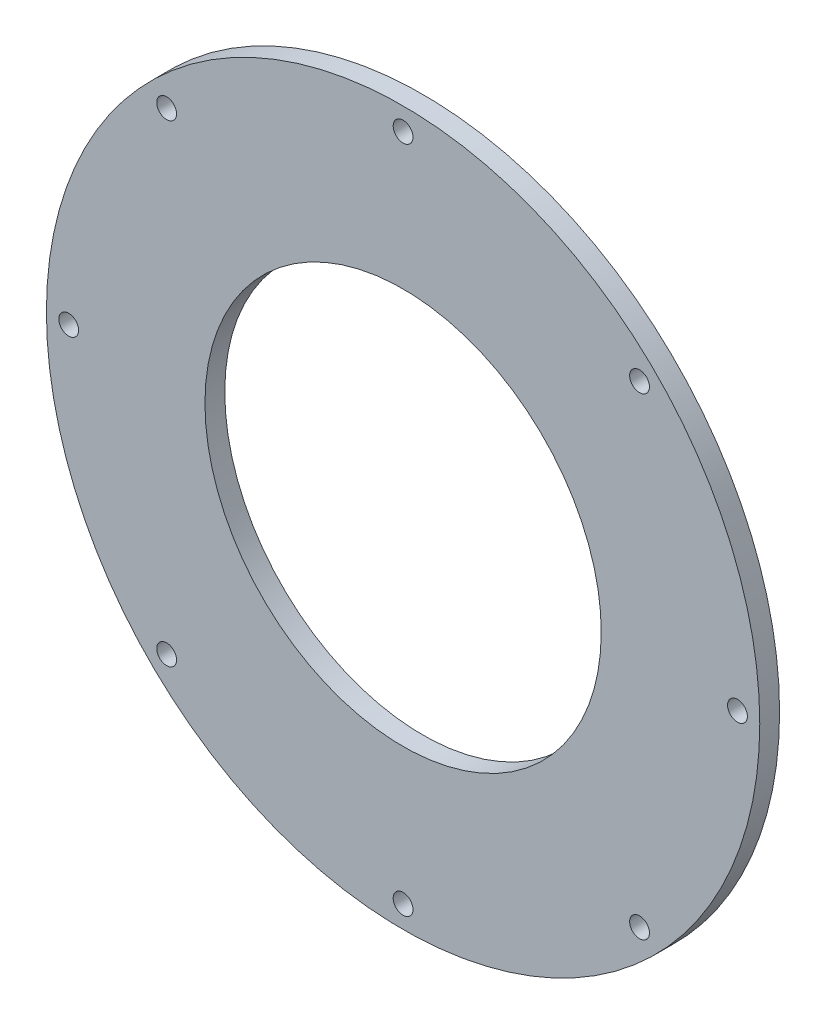
ISO-10303-21;
HEADER;
FILE_DESCRIPTION(('STEP AP214'),'2;1');
FILE_NAME('part.step','',(''),(''),'','','');
FILE_SCHEMA(('AUTOMOTIVE_DESIGN { 1 0 10303 214 1 1 1 1 }'));
ENDSEC;
DATA;
#1=APPLICATION_CONTEXT('core data for automotive mechanical design processes');
#2=APPLICATION_PROTOCOL_DEFINITION('international standard','automotive_design',2000,#1);
#3=PRODUCT_CONTEXT('',#1,'mechanical');
#4=PRODUCT('Part','Part','',(#3));
#5=PRODUCT_RELATED_PRODUCT_CATEGORY('part','',(#4));
#6=PRODUCT_DEFINITION_FORMATION('','',#4);
#7=PRODUCT_DEFINITION_CONTEXT('part definition',#1,'design');
#8=PRODUCT_DEFINITION('design','',#6,#7);
#9=PRODUCT_DEFINITION_SHAPE('','',#8);
#10=(LENGTH_UNIT() NAMED_UNIT(*) SI_UNIT(.MILLI.,.METRE.));
#11=(NAMED_UNIT(*) PLANE_ANGLE_UNIT() SI_UNIT($,.RADIAN.));
#12=(NAMED_UNIT(*) SI_UNIT($,.STERADIAN.) SOLID_ANGLE_UNIT());
#13=UNCERTAINTY_MEASURE_WITH_UNIT(LENGTH_MEASURE(1.E-05),#10,'distance_accuracy_value','');
#14=(GEOMETRIC_REPRESENTATION_CONTEXT(3) GLOBAL_UNCERTAINTY_ASSIGNED_CONTEXT((#13)) GLOBAL_UNIT_ASSIGNED_CONTEXT((#10,
#11,#12)) REPRESENTATION_CONTEXT('',''));
#15=CARTESIAN_POINT('',(0.,0.,0.));
#16=DIRECTION('',(0.,0.,1.));
#17=DIRECTION('',(1.,0.,0.));
#18=AXIS2_PLACEMENT_3D('',#15,#16,#17);
#19=CARTESIAN_POINT('',(0.,0.,4.));
#20=DIRECTION('',(0.,0.,1.));
#21=DIRECTION('',(1.,0.,0.));
#22=AXIS2_PLACEMENT_3D('',#19,#20,#21);
#23=PLANE('',#22);
#24=CARTESIAN_POINT('',(67.5,-7.05188000917013E-13,4.));
#25=DIRECTION('',(0.,0.,1.));
#26=DIRECTION('',(1.,0.,0.));
#27=AXIS2_PLACEMENT_3D('',#24,#25,#26);
#28=CIRCLE('',#27,2.);
#29=CARTESIAN_POINT('',(69.5,-7.05188000917013E-13,4.));
#30=VERTEX_POINT('',#29);
#31=EDGE_CURVE('E104',#30,#30,#28,.T.);
#32=ORIENTED_EDGE('',*,*,#31,.F.);
#33=EDGE_LOOP('',(#32));
#34=FACE_BOUND('',#33,.T.);
#35=CARTESIAN_POINT('',(4.69513010545102E-13,67.5,4.));
#36=DIRECTION('',(0.,0.,1.));
#37=DIRECTION('',(1.,0.,0.));
#38=AXIS2_PLACEMENT_3D('',#35,#36,#37);
#39=CIRCLE('',#38,2.);
#40=CARTESIAN_POINT('',(2.00000000000047,67.5,4.));
#41=VERTEX_POINT('',#40);
#42=EDGE_CURVE('E88',#41,#41,#39,.T.);
#43=ORIENTED_EDGE('',*,*,#42,.F.);
#44=EDGE_LOOP('',(#43));
#45=FACE_BOUND('',#44,.T.);
#46=CARTESIAN_POINT('',(-67.5,1.1903764904912E-12,4.));
#47=DIRECTION('',(0.,0.,1.));
#48=DIRECTION('',(1.,0.,0.));
#49=AXIS2_PLACEMENT_3D('',#46,#47,#48);
#50=CIRCLE('',#49,2.);
#51=CARTESIAN_POINT('',(-65.5,1.1903764904912E-12,4.));
#52=VERTEX_POINT('',#51);
#53=EDGE_CURVE('E72',#52,#52,#50,.T.);
#54=ORIENTED_EDGE('',*,*,#53,.F.);
#55=EDGE_LOOP('',(#54));
#56=FACE_BOUND('',#55,.T.);
#57=CARTESIAN_POINT('',(0.,-67.5,4.));
#58=DIRECTION('',(0.,0.,1.));
#59=DIRECTION('',(1.,0.,0.));
#60=AXIS2_PLACEMENT_3D('',#57,#58,#59);
#61=CIRCLE('',#60,2.);
#62=CARTESIAN_POINT('',(2.,-67.5,4.));
#63=VERTEX_POINT('',#62);
#64=EDGE_CURVE('E56',#63,#63,#61,.T.);
#65=ORIENTED_EDGE('',*,*,#64,.F.);
#66=EDGE_LOOP('',(#65));
#67=FACE_BOUND('',#66,.T.);
#68=CARTESIAN_POINT('',(0.,0.,4.));
#69=DIRECTION('',(0.,0.,1.));
#70=DIRECTION('',(1.,0.,0.));
#71=AXIS2_PLACEMENT_3D('',#68,#69,#70);
#72=CIRCLE('',#71,72.);
#73=CARTESIAN_POINT('',(72.,0.,4.));
#74=VERTEX_POINT('',#73);
#75=EDGE_CURVE('E10',#74,#74,#72,.T.);
#76=ORIENTED_EDGE('',*,*,#75,.T.);
#77=EDGE_LOOP('',(#76));
#78=FACE_BOUND('',#77,.T.);
#79=CARTESIAN_POINT('',(0.,0.,4.));
#80=DIRECTION('',(0.,0.,1.));
#81=DIRECTION('',(1.,0.,0.));
#82=AXIS2_PLACEMENT_3D('',#79,#80,#81);
#83=CIRCLE('',#82,40.);
#84=CARTESIAN_POINT('',(40.,0.,4.));
#85=VERTEX_POINT('',#84);
#86=EDGE_CURVE('E50',#85,#85,#83,.T.);
#87=ORIENTED_EDGE('',*,*,#86,.F.);
#88=EDGE_LOOP('',(#87));
#89=FACE_BOUND('',#88,.T.);
#90=CARTESIAN_POINT('',(-47.7297077300927,-47.7297077300912,4.));
#91=DIRECTION('',(0.,0.,1.));
#92=DIRECTION('',(1.,0.,0.));
#93=AXIS2_PLACEMENT_3D('',#90,#91,#92);
#94=CIRCLE('',#93,1.99999999999999);
#95=CARTESIAN_POINT('',(-45.7297077300927,-47.7297077300912,4.));
#96=VERTEX_POINT('',#95);
#97=EDGE_CURVE('E64',#96,#96,#94,.T.);
#98=ORIENTED_EDGE('',*,*,#97,.F.);
#99=EDGE_LOOP('',(#98));
#100=FACE_BOUND('',#99,.T.);
#101=CARTESIAN_POINT('',(-47.7297077300917,47.7297077300922,4.));
#102=DIRECTION('',(0.,0.,1.));
#103=DIRECTION('',(1.,0.,0.));
#104=AXIS2_PLACEMENT_3D('',#101,#102,#103);
#105=CIRCLE('',#104,1.99999999999998);
#106=CARTESIAN_POINT('',(-45.7297077300917,47.7297077300922,4.));
#107=VERTEX_POINT('',#106);
#108=EDGE_CURVE('E80',#107,#107,#105,.T.);
#109=ORIENTED_EDGE('',*,*,#108,.F.);
#110=EDGE_LOOP('',(#109));
#111=FACE_BOUND('',#110,.T.);
#112=CARTESIAN_POINT('',(47.7297077300924,47.7297077300915,4.));
#113=DIRECTION('',(0.,0.,1.));
#114=DIRECTION('',(1.,0.,0.));
#115=AXIS2_PLACEMENT_3D('',#112,#113,#114);
#116=CIRCLE('',#115,2.);
#117=CARTESIAN_POINT('',(49.7297077300924,47.7297077300915,4.));
#118=VERTEX_POINT('',#117);
#119=EDGE_CURVE('E96',#118,#118,#116,.T.);
#120=ORIENTED_EDGE('',*,*,#119,.F.);
#121=EDGE_LOOP('',(#120));
#122=FACE_BOUND('',#121,.T.);
#123=CARTESIAN_POINT('',(47.7297077300914,-47.7297077300925,4.));
#124=DIRECTION('',(0.,0.,1.));
#125=DIRECTION('',(1.,0.,0.));
#126=AXIS2_PLACEMENT_3D('',#123,#124,#125);
#127=CIRCLE('',#126,2.);
#128=CARTESIAN_POINT('',(49.7297077300914,-47.7297077300925,4.));
#129=VERTEX_POINT('',#128);
#130=EDGE_CURVE('E112',#129,#129,#127,.T.);
#131=ORIENTED_EDGE('',*,*,#130,.F.);
#132=EDGE_LOOP('',(#131));
#133=FACE_BOUND('',#132,.T.);
#134=ADVANCED_FACE('F37',(#34,#45,#56,#67,#78,#89,#100,#111,#122,#133),#23,.T.);
#135=CARTESIAN_POINT('',(0.,0.,0.));
#136=DIRECTION('',(0.,0.,1.));
#137=DIRECTION('',(1.,0.,0.));
#138=AXIS2_PLACEMENT_3D('',#135,#136,#137);
#139=PLANE('',#138);
#140=CARTESIAN_POINT('',(0.,0.,0.));
#141=DIRECTION('',(0.,0.,1.));
#142=DIRECTION('',(1.,0.,0.));
#143=AXIS2_PLACEMENT_3D('',#140,#141,#142);
#144=CIRCLE('',#143,72.);
#145=CARTESIAN_POINT('',(72.,0.,0.));
#146=VERTEX_POINT('',#145);
#147=EDGE_CURVE('E41',#146,#146,#144,.T.);
#148=ORIENTED_EDGE('',*,*,#147,.F.);
#149=EDGE_LOOP('',(#148));
#150=FACE_BOUND('',#149,.T.);
#151=CARTESIAN_POINT('',(0.,0.,0.));
#152=DIRECTION('',(0.,0.,1.));
#153=DIRECTION('',(1.,0.,0.));
#154=AXIS2_PLACEMENT_3D('',#151,#152,#153);
#155=CIRCLE('',#154,40.);
#156=CARTESIAN_POINT('',(40.,0.,0.));
#157=VERTEX_POINT('',#156);
#158=EDGE_CURVE('E52',#157,#157,#155,.T.);
#159=ORIENTED_EDGE('',*,*,#158,.T.);
#160=EDGE_LOOP('',(#159));
#161=FACE_BOUND('',#160,.T.);
#162=CARTESIAN_POINT('',(0.,-67.5,0.));
#163=DIRECTION('',(0.,0.,1.));
#164=DIRECTION('',(1.,0.,0.));
#165=AXIS2_PLACEMENT_3D('',#162,#163,#164);
#166=CIRCLE('',#165,2.);
#167=CARTESIAN_POINT('',(2.,-67.5,0.));
#168=VERTEX_POINT('',#167);
#169=EDGE_CURVE('E60',#168,#168,#166,.T.);
#170=ORIENTED_EDGE('',*,*,#169,.T.);
#171=EDGE_LOOP('',(#170));
#172=FACE_BOUND('',#171,.T.);
#173=CARTESIAN_POINT('',(-47.7297077300927,-47.7297077300912,0.));
#174=DIRECTION('',(0.,0.,1.));
#175=DIRECTION('',(1.,0.,0.));
#176=AXIS2_PLACEMENT_3D('',#173,#174,#175);
#177=CIRCLE('',#176,1.99999999999999);
#178=CARTESIAN_POINT('',(-45.7297077300927,-47.7297077300912,0.));
#179=VERTEX_POINT('',#178);
#180=EDGE_CURVE('E68',#179,#179,#177,.T.);
#181=ORIENTED_EDGE('',*,*,#180,.T.);
#182=EDGE_LOOP('',(#181));
#183=FACE_BOUND('',#182,.T.);
#184=CARTESIAN_POINT('',(-67.5,1.1903764904912E-12,0.));
#185=DIRECTION('',(0.,0.,1.));
#186=DIRECTION('',(1.,0.,0.));
#187=AXIS2_PLACEMENT_3D('',#184,#185,#186);
#188=CIRCLE('',#187,2.);
#189=CARTESIAN_POINT('',(-65.5,1.1903764904912E-12,0.));
#190=VERTEX_POINT('',#189);
#191=EDGE_CURVE('E76',#190,#190,#188,.T.);
#192=ORIENTED_EDGE('',*,*,#191,.T.);
#193=EDGE_LOOP('',(#192));
#194=FACE_BOUND('',#193,.T.);
#195=CARTESIAN_POINT('',(-47.7297077300917,47.7297077300922,0.));
#196=DIRECTION('',(0.,0.,1.));
#197=DIRECTION('',(1.,0.,0.));
#198=AXIS2_PLACEMENT_3D('',#195,#196,#197);
#199=CIRCLE('',#198,1.99999999999998);
#200=CARTESIAN_POINT('',(-45.7297077300917,47.7297077300922,0.));
#201=VERTEX_POINT('',#200);
#202=EDGE_CURVE('E84',#201,#201,#199,.T.);
#203=ORIENTED_EDGE('',*,*,#202,.T.);
#204=EDGE_LOOP('',(#203));
#205=FACE_BOUND('',#204,.T.);
#206=CARTESIAN_POINT('',(4.69513010545102E-13,67.5,0.));
#207=DIRECTION('',(0.,0.,1.));
#208=DIRECTION('',(1.,0.,0.));
#209=AXIS2_PLACEMENT_3D('',#206,#207,#208);
#210=CIRCLE('',#209,2.);
#211=CARTESIAN_POINT('',(2.00000000000047,67.5,0.));
#212=VERTEX_POINT('',#211);
#213=EDGE_CURVE('E92',#212,#212,#210,.T.);
#214=ORIENTED_EDGE('',*,*,#213,.T.);
#215=EDGE_LOOP('',(#214));
#216=FACE_BOUND('',#215,.T.);
#217=CARTESIAN_POINT('',(47.7297077300924,47.7297077300915,0.));
#218=DIRECTION('',(0.,0.,1.));
#219=DIRECTION('',(1.,0.,0.));
#220=AXIS2_PLACEMENT_3D('',#217,#218,#219);
#221=CIRCLE('',#220,2.);
#222=CARTESIAN_POINT('',(49.7297077300924,47.7297077300915,0.));
#223=VERTEX_POINT('',#222);
#224=EDGE_CURVE('E100',#223,#223,#221,.T.);
#225=ORIENTED_EDGE('',*,*,#224,.T.);
#226=EDGE_LOOP('',(#225));
#227=FACE_BOUND('',#226,.T.);
#228=CARTESIAN_POINT('',(67.5,-7.05188000917013E-13,0.));
#229=DIRECTION('',(0.,0.,1.));
#230=DIRECTION('',(1.,0.,0.));
#231=AXIS2_PLACEMENT_3D('',#228,#229,#230);
#232=CIRCLE('',#231,2.);
#233=CARTESIAN_POINT('',(69.5,-7.05188000917013E-13,0.));
#234=VERTEX_POINT('',#233);
#235=EDGE_CURVE('E108',#234,#234,#232,.T.);
#236=ORIENTED_EDGE('',*,*,#235,.T.);
#237=EDGE_LOOP('',(#236));
#238=FACE_BOUND('',#237,.T.);
#239=CARTESIAN_POINT('',(47.7297077300914,-47.7297077300925,0.));
#240=DIRECTION('',(0.,0.,1.));
#241=DIRECTION('',(1.,0.,0.));
#242=AXIS2_PLACEMENT_3D('',#239,#240,#241);
#243=CIRCLE('',#242,2.);
#244=CARTESIAN_POINT('',(49.7297077300914,-47.7297077300925,0.));
#245=VERTEX_POINT('',#244);
#246=EDGE_CURVE('E116',#245,#245,#243,.T.);
#247=ORIENTED_EDGE('',*,*,#246,.T.);
#248=EDGE_LOOP('',(#247));
#249=FACE_BOUND('',#248,.T.);
#250=ADVANCED_FACE('F128',(#150,#161,#172,#183,#194,#205,#216,#227,#238,#249),#139,.F.);
#251=CARTESIAN_POINT('',(0.,0.,4.));
#252=DIRECTION('',(0.,0.,-1.));
#253=DIRECTION('',(-1.,0.,0.));
#254=AXIS2_PLACEMENT_3D('',#251,#252,#253);
#255=CYLINDRICAL_SURFACE('',#254,72.);
#256=ORIENTED_EDGE('',*,*,#75,.F.);
#257=EDGE_LOOP('',(#256));
#258=FACE_BOUND('',#257,.T.);
#259=ORIENTED_EDGE('',*,*,#147,.T.);
#260=EDGE_LOOP('',(#259));
#261=FACE_BOUND('',#260,.T.);
#262=ADVANCED_FACE('F39',(#258,#261),#255,.T.);
#263=CARTESIAN_POINT('',(0.,0.,4.));
#264=DIRECTION('',(0.,0.,-1.));
#265=DIRECTION('',(-1.,0.,0.));
#266=AXIS2_PLACEMENT_3D('',#263,#264,#265);
#267=CYLINDRICAL_SURFACE('',#266,40.);
#268=ORIENTED_EDGE('',*,*,#86,.T.);
#269=EDGE_LOOP('',(#268));
#270=FACE_BOUND('',#269,.T.);
#271=ORIENTED_EDGE('',*,*,#158,.F.);
#272=EDGE_LOOP('',(#271));
#273=FACE_BOUND('',#272,.T.);
#274=ADVANCED_FACE('F138',(#270,#273),#267,.F.);
#275=CARTESIAN_POINT('',(0.,-67.5,4.));
#276=DIRECTION('',(0.,0.,-1.));
#277=DIRECTION('',(-1.,0.,0.));
#278=AXIS2_PLACEMENT_3D('',#275,#276,#277);
#279=CYLINDRICAL_SURFACE('',#278,2.);
#280=ORIENTED_EDGE('',*,*,#64,.T.);
#281=EDGE_LOOP('',(#280));
#282=FACE_BOUND('',#281,.T.);
#283=ORIENTED_EDGE('',*,*,#169,.F.);
#284=EDGE_LOOP('',(#283));
#285=FACE_BOUND('',#284,.T.);
#286=ADVANCED_FACE('F141',(#282,#285),#279,.F.);
#287=CARTESIAN_POINT('',(-47.7297077300927,-47.7297077300912,4.));
#288=DIRECTION('',(0.,0.,-1.));
#289=DIRECTION('',(-1.,0.,0.));
#290=AXIS2_PLACEMENT_3D('',#287,#288,#289);
#291=CYLINDRICAL_SURFACE('',#290,1.99999999999999);
#292=ORIENTED_EDGE('',*,*,#97,.T.);
#293=EDGE_LOOP('',(#292));
#294=FACE_BOUND('',#293,.T.);
#295=ORIENTED_EDGE('',*,*,#180,.F.);
#296=EDGE_LOOP('',(#295));
#297=FACE_BOUND('',#296,.T.);
#298=ADVANCED_FACE('F145',(#294,#297),#291,.F.);
#299=CARTESIAN_POINT('',(-67.5,1.1903764904912E-12,4.));
#300=DIRECTION('',(0.,0.,-1.));
#301=DIRECTION('',(-1.,0.,0.));
#302=AXIS2_PLACEMENT_3D('',#299,#300,#301);
#303=CYLINDRICAL_SURFACE('',#302,2.);
#304=ORIENTED_EDGE('',*,*,#53,.T.);
#305=EDGE_LOOP('',(#304));
#306=FACE_BOUND('',#305,.T.);
#307=ORIENTED_EDGE('',*,*,#191,.F.);
#308=EDGE_LOOP('',(#307));
#309=FACE_BOUND('',#308,.T.);
#310=ADVANCED_FACE('F149',(#306,#309),#303,.F.);
#311=CARTESIAN_POINT('',(-47.7297077300917,47.7297077300922,4.));
#312=DIRECTION('',(0.,0.,-1.));
#313=DIRECTION('',(-1.,0.,0.));
#314=AXIS2_PLACEMENT_3D('',#311,#312,#313);
#315=CYLINDRICAL_SURFACE('',#314,1.99999999999998);
#316=ORIENTED_EDGE('',*,*,#108,.T.);
#317=EDGE_LOOP('',(#316));
#318=FACE_BOUND('',#317,.T.);
#319=ORIENTED_EDGE('',*,*,#202,.F.);
#320=EDGE_LOOP('',(#319));
#321=FACE_BOUND('',#320,.T.);
#322=ADVANCED_FACE('F153',(#318,#321),#315,.F.);
#323=CARTESIAN_POINT('',(4.69513010545102E-13,67.5,4.));
#324=DIRECTION('',(0.,0.,-1.));
#325=DIRECTION('',(-1.,0.,0.));
#326=AXIS2_PLACEMENT_3D('',#323,#324,#325);
#327=CYLINDRICAL_SURFACE('',#326,2.);
#328=ORIENTED_EDGE('',*,*,#42,.T.);
#329=EDGE_LOOP('',(#328));
#330=FACE_BOUND('',#329,.T.);
#331=ORIENTED_EDGE('',*,*,#213,.F.);
#332=EDGE_LOOP('',(#331));
#333=FACE_BOUND('',#332,.T.);
#334=ADVANCED_FACE('F157',(#330,#333),#327,.F.);
#335=CARTESIAN_POINT('',(47.7297077300924,47.7297077300915,4.));
#336=DIRECTION('',(0.,0.,-1.));
#337=DIRECTION('',(-1.,0.,0.));
#338=AXIS2_PLACEMENT_3D('',#335,#336,#337);
#339=CYLINDRICAL_SURFACE('',#338,2.);
#340=ORIENTED_EDGE('',*,*,#119,.T.);
#341=EDGE_LOOP('',(#340));
#342=FACE_BOUND('',#341,.T.);
#343=ORIENTED_EDGE('',*,*,#224,.F.);
#344=EDGE_LOOP('',(#343));
#345=FACE_BOUND('',#344,.T.);
#346=ADVANCED_FACE('F161',(#342,#345),#339,.F.);
#347=CARTESIAN_POINT('',(67.5,-7.05188000917013E-13,4.));
#348=DIRECTION('',(0.,0.,-1.));
#349=DIRECTION('',(-1.,0.,0.));
#350=AXIS2_PLACEMENT_3D('',#347,#348,#349);
#351=CYLINDRICAL_SURFACE('',#350,2.);
#352=ORIENTED_EDGE('',*,*,#31,.T.);
#353=EDGE_LOOP('',(#352));
#354=FACE_BOUND('',#353,.T.);
#355=ORIENTED_EDGE('',*,*,#235,.F.);
#356=EDGE_LOOP('',(#355));
#357=FACE_BOUND('',#356,.T.);
#358=ADVANCED_FACE('F165',(#354,#357),#351,.F.);
#359=CARTESIAN_POINT('',(47.7297077300914,-47.7297077300925,4.));
#360=DIRECTION('',(0.,0.,-1.));
#361=DIRECTION('',(-1.,0.,0.));
#362=AXIS2_PLACEMENT_3D('',#359,#360,#361);
#363=CYLINDRICAL_SURFACE('',#362,2.);
#364=ORIENTED_EDGE('',*,*,#130,.T.);
#365=EDGE_LOOP('',(#364));
#366=FACE_BOUND('',#365,.T.);
#367=ORIENTED_EDGE('',*,*,#246,.F.);
#368=EDGE_LOOP('',(#367));
#369=FACE_BOUND('',#368,.T.);
#370=ADVANCED_FACE('F124',(#366,#369),#363,.F.);
#371=CLOSED_SHELL('',(#134,#250,#262,#274,#286,#298,#310,#322,#334,#346,#358,#370));
#372=MANIFOLD_SOLID_BREP('B2',#371);
#373=ADVANCED_BREP_SHAPE_REPRESENTATION('',(#18,#372),#14);
#374=SHAPE_DEFINITION_REPRESENTATION(#9,#373);
ENDSEC;
END-ISO-10303-21;
